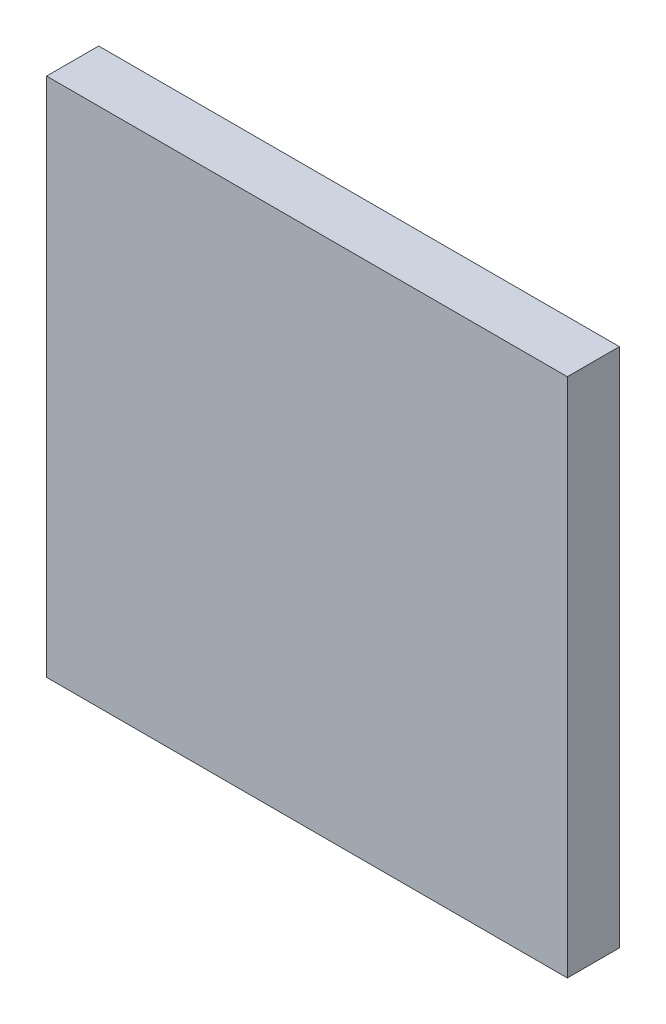
ISO-10303-21;
HEADER;
FILE_DESCRIPTION(('STEP AP214'),'2;1');
FILE_NAME('part.step','',(''),(''),'','','');
FILE_SCHEMA(('AUTOMOTIVE_DESIGN { 1 0 10303 214 1 1 1 1 }'));
ENDSEC;
DATA;
#1=APPLICATION_CONTEXT('core data for automotive mechanical design processes');
#2=APPLICATION_PROTOCOL_DEFINITION('international standard','automotive_design',2000,#1);
#3=PRODUCT_CONTEXT('',#1,'mechanical');
#4=PRODUCT('Part','Part','',(#3));
#5=PRODUCT_RELATED_PRODUCT_CATEGORY('part','',(#4));
#6=PRODUCT_DEFINITION_FORMATION('','',#4);
#7=PRODUCT_DEFINITION_CONTEXT('part definition',#1,'design');
#8=PRODUCT_DEFINITION('design','',#6,#7);
#9=PRODUCT_DEFINITION_SHAPE('','',#8);
#10=(LENGTH_UNIT() NAMED_UNIT(*) SI_UNIT(.MILLI.,.METRE.));
#11=(NAMED_UNIT(*) PLANE_ANGLE_UNIT() SI_UNIT($,.RADIAN.));
#12=(NAMED_UNIT(*) SI_UNIT($,.STERADIAN.) SOLID_ANGLE_UNIT());
#13=UNCERTAINTY_MEASURE_WITH_UNIT(LENGTH_MEASURE(1.E-05),#10,'distance_accuracy_value','');
#14=(GEOMETRIC_REPRESENTATION_CONTEXT(3) GLOBAL_UNCERTAINTY_ASSIGNED_CONTEXT((#13)) GLOBAL_UNIT_ASSIGNED_CONTEXT((#10,
#11,#12)) REPRESENTATION_CONTEXT('',''));
#15=CARTESIAN_POINT('',(0.,0.,0.));
#16=DIRECTION('',(0.,0.,1.));
#17=DIRECTION('',(1.,0.,0.));
#18=AXIS2_PLACEMENT_3D('',#15,#16,#17);
#19=CARTESIAN_POINT('',(0.,0.,2.54));
#20=DIRECTION('',(1.,0.,0.));
#21=DIRECTION('',(0.,0.,-1.));
#22=AXIS2_PLACEMENT_3D('',#19,#20,#21);
#23=PLANE('',#22);
#24=DIRECTION('',(0.,-1.,0.));
#25=VECTOR('',#24,1.);
#26=CARTESIAN_POINT('',(0.,0.,0.));
#27=LINE('',#26,#25);
#28=CARTESIAN_POINT('',(0.,25.4,0.));
#29=VERTEX_POINT('',#28);
#30=CARTESIAN_POINT('',(0.,0.,0.));
#31=VERTEX_POINT('',#30);
#32=EDGE_CURVE('E99',#29,#31,#27,.T.);
#33=ORIENTED_EDGE('',*,*,#32,.T.);
#34=DIRECTION('',(0.,0.,-1.));
#35=VECTOR('',#34,1.);
#36=CARTESIAN_POINT('',(0.,0.,2.54));
#37=LINE('',#36,#35);
#38=CARTESIAN_POINT('',(0.,0.,2.54));
#39=VERTEX_POINT('',#38);
#40=EDGE_CURVE('E11',#39,#31,#37,.T.);
#41=ORIENTED_EDGE('',*,*,#40,.F.);
#42=DIRECTION('',(0.,-1.,0.));
#43=VECTOR('',#42,1.);
#44=CARTESIAN_POINT('',(0.,0.,2.54));
#45=LINE('',#44,#43);
#46=CARTESIAN_POINT('',(0.,25.4,2.54));
#47=VERTEX_POINT('',#46);
#48=EDGE_CURVE('E87',#47,#39,#45,.T.);
#49=ORIENTED_EDGE('',*,*,#48,.F.);
#50=DIRECTION('',(0.,0.,-1.));
#51=VECTOR('',#50,1.);
#52=CARTESIAN_POINT('',(0.,25.4,2.54));
#53=LINE('',#52,#51);
#54=EDGE_CURVE('E95',#47,#29,#53,.T.);
#55=ORIENTED_EDGE('',*,*,#54,.T.);
#56=EDGE_LOOP('',(#33,#41,#49,#55));
#57=FACE_BOUND('',#56,.T.);
#58=ADVANCED_FACE('F36',(#57),#23,.F.);
#59=CARTESIAN_POINT('',(0.,0.,2.54));
#60=DIRECTION('',(0.,1.,0.));
#61=DIRECTION('',(0.,0.,1.));
#62=AXIS2_PLACEMENT_3D('',#59,#60,#61);
#63=PLANE('',#62);
#64=DIRECTION('',(1.,0.,0.));
#65=VECTOR('',#64,1.);
#66=CARTESIAN_POINT('',(0.,0.,0.));
#67=LINE('',#66,#65);
#68=CARTESIAN_POINT('',(25.4,0.,0.));
#69=VERTEX_POINT('',#68);
#70=EDGE_CURVE('E91',#31,#69,#67,.T.);
#71=ORIENTED_EDGE('',*,*,#70,.T.);
#72=DIRECTION('',(0.,0.,-1.));
#73=VECTOR('',#72,1.);
#74=CARTESIAN_POINT('',(25.4,0.,2.54));
#75=LINE('',#74,#73);
#76=CARTESIAN_POINT('',(25.4,0.,2.54));
#77=VERTEX_POINT('',#76);
#78=EDGE_CURVE('E44',#77,#69,#75,.T.);
#79=ORIENTED_EDGE('',*,*,#78,.F.);
#80=DIRECTION('',(1.,0.,0.));
#81=VECTOR('',#80,1.);
#82=CARTESIAN_POINT('',(0.,0.,2.54));
#83=LINE('',#82,#81);
#84=EDGE_CURVE('E82',#39,#77,#83,.T.);
#85=ORIENTED_EDGE('',*,*,#84,.F.);
#86=ORIENTED_EDGE('',*,*,#40,.T.);
#87=EDGE_LOOP('',(#71,#79,#85,#86));
#88=FACE_BOUND('',#87,.T.);
#89=ADVANCED_FACE('F90',(#88),#63,.F.);
#90=CARTESIAN_POINT('',(25.4,0.,2.54));
#91=DIRECTION('',(-1.,0.,0.));
#92=DIRECTION('',(0.,0.,1.));
#93=AXIS2_PLACEMENT_3D('',#90,#91,#92);
#94=PLANE('',#93);
#95=DIRECTION('',(0.,1.,0.));
#96=VECTOR('',#95,1.);
#97=CARTESIAN_POINT('',(25.4,0.,0.));
#98=LINE('',#97,#96);
#99=CARTESIAN_POINT('',(25.4,25.4,0.));
#100=VERTEX_POINT('',#99);
#101=EDGE_CURVE('E69',#69,#100,#98,.T.);
#102=ORIENTED_EDGE('',*,*,#101,.T.);
#103=DIRECTION('',(0.,0.,-1.));
#104=VECTOR('',#103,1.);
#105=CARTESIAN_POINT('',(25.4,25.4,2.54));
#106=LINE('',#105,#104);
#107=CARTESIAN_POINT('',(25.4,25.4,2.54));
#108=VERTEX_POINT('',#107);
#109=EDGE_CURVE('E92',#108,#100,#106,.T.);
#110=ORIENTED_EDGE('',*,*,#109,.F.);
#111=DIRECTION('',(0.,1.,0.));
#112=VECTOR('',#111,1.);
#113=CARTESIAN_POINT('',(25.4,0.,2.54));
#114=LINE('',#113,#112);
#115=EDGE_CURVE('E85',#77,#108,#114,.T.);
#116=ORIENTED_EDGE('',*,*,#115,.F.);
#117=ORIENTED_EDGE('',*,*,#78,.T.);
#118=EDGE_LOOP('',(#102,#110,#116,#117));
#119=FACE_BOUND('',#118,.T.);
#120=ADVANCED_FACE('F93',(#119),#94,.F.);
#121=CARTESIAN_POINT('',(0.,25.4,2.54));
#122=DIRECTION('',(0.,-1.,0.));
#123=DIRECTION('',(0.,0.,-1.));
#124=AXIS2_PLACEMENT_3D('',#121,#122,#123);
#125=PLANE('',#124);
#126=DIRECTION('',(-1.,0.,0.));
#127=VECTOR('',#126,1.);
#128=CARTESIAN_POINT('',(0.,25.4,0.));
#129=LINE('',#128,#127);
#130=EDGE_CURVE('E75',#100,#29,#129,.T.);
#131=ORIENTED_EDGE('',*,*,#130,.T.);
#132=ORIENTED_EDGE('',*,*,#54,.F.);
#133=DIRECTION('',(-1.,0.,0.));
#134=VECTOR('',#133,1.);
#135=CARTESIAN_POINT('',(0.,25.4,2.54));
#136=LINE('',#135,#134);
#137=EDGE_CURVE('E52',#108,#47,#136,.T.);
#138=ORIENTED_EDGE('',*,*,#137,.F.);
#139=ORIENTED_EDGE('',*,*,#109,.T.);
#140=EDGE_LOOP('',(#131,#132,#138,#139));
#141=FACE_BOUND('',#140,.T.);
#142=ADVANCED_FACE('F106',(#141),#125,.F.);
#143=CARTESIAN_POINT('',(0.,25.4,2.54));
#144=DIRECTION('',(0.,0.,-1.));
#145=DIRECTION('',(-1.,0.,0.));
#146=AXIS2_PLACEMENT_3D('',#143,#144,#145);
#147=PLANE('',#146);
#148=ORIENTED_EDGE('',*,*,#48,.T.);
#149=ORIENTED_EDGE('',*,*,#84,.T.);
#150=ORIENTED_EDGE('',*,*,#115,.T.);
#151=ORIENTED_EDGE('',*,*,#137,.T.);
#152=EDGE_LOOP('',(#148,#149,#150,#151));
#153=FACE_BOUND('',#152,.T.);
#154=ADVANCED_FACE('F83',(#153),#147,.F.);
#155=CARTESIAN_POINT('',(0.,25.4,0.));
#156=DIRECTION('',(0.,0.,-1.));
#157=DIRECTION('',(-1.,0.,0.));
#158=AXIS2_PLACEMENT_3D('',#155,#156,#157);
#159=PLANE('',#158);
#160=ORIENTED_EDGE('',*,*,#32,.F.);
#161=ORIENTED_EDGE('',*,*,#130,.F.);
#162=ORIENTED_EDGE('',*,*,#101,.F.);
#163=ORIENTED_EDGE('',*,*,#70,.F.);
#164=EDGE_LOOP('',(#160,#161,#162,#163));
#165=FACE_BOUND('',#164,.T.);
#166=ADVANCED_FACE('F109',(#165),#159,.T.);
#167=CLOSED_SHELL('',(#58,#89,#120,#142,#154,#166));
#168=MANIFOLD_SOLID_BREP('B2',#167);
#169=ADVANCED_BREP_SHAPE_REPRESENTATION('',(#18,#168),#14);
#170=SHAPE_DEFINITION_REPRESENTATION(#9,#169);
ENDSEC;
END-ISO-10303-21;
